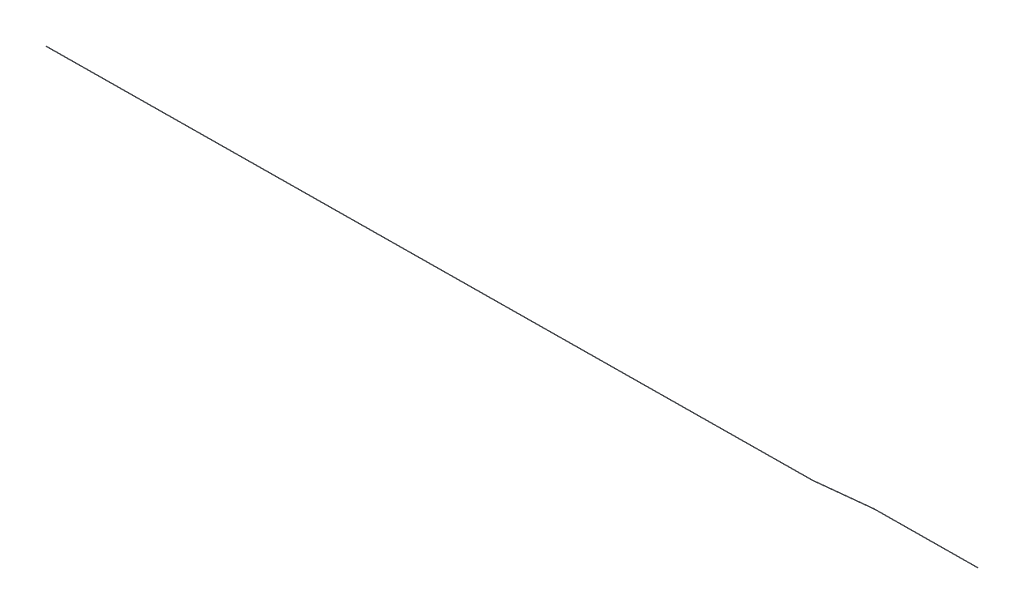
ISO-10303-21;
HEADER;
FILE_DESCRIPTION(('STEP AP214'),'2;1');
FILE_NAME('part.step','',(''),(''),'','','');
FILE_SCHEMA(('AUTOMOTIVE_DESIGN { 1 0 10303 214 1 1 1 1 }'));
ENDSEC;
DATA;
#1=APPLICATION_CONTEXT('core data for automotive mechanical design processes');
#2=APPLICATION_PROTOCOL_DEFINITION('international standard','automotive_design',2000,#1);
#3=PRODUCT_CONTEXT('',#1,'mechanical');
#4=PRODUCT('Part','Part','',(#3));
#5=PRODUCT_RELATED_PRODUCT_CATEGORY('part','',(#4));
#6=PRODUCT_DEFINITION_FORMATION('','',#4);
#7=PRODUCT_DEFINITION_CONTEXT('part definition',#1,'design');
#8=PRODUCT_DEFINITION('design','',#6,#7);
#9=PRODUCT_DEFINITION_SHAPE('','',#8);
#10=(LENGTH_UNIT() NAMED_UNIT(*) SI_UNIT(.MILLI.,.METRE.));
#11=(NAMED_UNIT(*) PLANE_ANGLE_UNIT() SI_UNIT($,.RADIAN.));
#12=(NAMED_UNIT(*) SI_UNIT($,.STERADIAN.) SOLID_ANGLE_UNIT());
#13=UNCERTAINTY_MEASURE_WITH_UNIT(LENGTH_MEASURE(1.E-05),#10,'distance_accuracy_value','');
#14=(GEOMETRIC_REPRESENTATION_CONTEXT(3) GLOBAL_UNCERTAINTY_ASSIGNED_CONTEXT((#13)) GLOBAL_UNIT_ASSIGNED_CONTEXT((#10,
#11,#12)) REPRESENTATION_CONTEXT('',''));
#15=CARTESIAN_POINT('',(0.,0.,0.));
#16=DIRECTION('',(0.,0.,1.));
#17=DIRECTION('',(1.,0.,0.));
#18=AXIS2_PLACEMENT_3D('',#15,#16,#17);
#19=CARTESIAN_POINT('',(413.924770547285,-1.58560776822858,-7.11603817891515));
#20=DIRECTION('',(-0.999980147228154,-0.00533980812218147,0.00334538469796255));
#21=DIRECTION('',(0.00533983800292731,-0.99998574296342,0.));
#22=AXIS2_PLACEMENT_3D('',#19,#20,#21);
#23=PLANE('',#22);
#24=CARTESIAN_POINT('',(413.924770547285,-1.58560776822858,-7.11603817891515));
#25=DIRECTION('',(-0.999980147228154,-0.00533980812218147,0.00334538469796255));
#26=DIRECTION('',(0.00533983800292731,-0.99998574296342,0.));
#27=AXIS2_PLACEMENT_3D('',#24,#25,#26);
#28=CIRCLE('',#27,0.15);
#29=CARTESIAN_POINT('',(413.925571522985,-1.73560562967309,-7.11603817891515));
#30=VERTEX_POINT('',#29);
#31=EDGE_CURVE('E40',#30,#30,#28,.T.);
#32=ORIENTED_EDGE('',*,*,#31,.F.);
#33=EDGE_LOOP('',(#32));
#34=FACE_BOUND('',#33,.T.);
#35=ADVANCED_FACE('F37',(#34),#23,.F.);
#36=CARTESIAN_POINT('',(-387.158080084603,-7.56501526759895,-0.791581331178724));
#37=DIRECTION('',(-0.999962548308179,-0.00860432697053628,0.000931417412730323));
#38=DIRECTION('',(0.00860416806883576,-0.999962968239497,-0.000174474916960672));
#39=AXIS2_PLACEMENT_3D('',#36,#37,#38);
#40=PLANE('',#39);
#41=CARTESIAN_POINT('',(-387.158080084603,-7.56501526759895,-0.791581331178724));
#42=DIRECTION('',(-0.999962548308179,-0.00860432697053628,0.000931417412730323));
#43=DIRECTION('',(0.00860416806883576,-0.999962968239497,-0.000174474916960672));
#44=AXIS2_PLACEMENT_3D('',#41,#42,#43);
#45=CIRCLE('',#44,0.15);
#46=CARTESIAN_POINT('',(-387.156789459393,-7.71500971283488,-0.791607502416268));
#47=VERTEX_POINT('',#46);
#48=EDGE_CURVE('E44',#47,#47,#45,.T.);
#49=ORIENTED_EDGE('',*,*,#48,.T.);
#50=EDGE_LOOP('',(#49));
#51=FACE_BOUND('',#50,.T.);
#52=ADVANCED_FACE('F60',(#51),#40,.T.);
#53=CARTESIAN_POINT('',(324.053927769802,-2.06551035183558,-6.81537966778954));
#54=DIRECTION('',(0.999980147228154,0.00533980812218148,-0.00334538469796255));
#55=DIRECTION('',(-0.00533983800292731,0.99998574296342,0.));
#56=AXIS2_PLACEMENT_3D('',#53,#54,#55);
#57=CYLINDRICAL_SURFACE('',#56,0.15);
#58=CARTESIAN_POINT('',(324.253923799248,-2.06444239021114,-6.81604874472912));
#59=DIRECTION('',(0.998307133454409,0.000468158546201777,-0.0581605374942275));
#60=DIRECTION('',(-0.0578907967974328,-0.0885307727506247,-0.994389741460729));
#61=AXIS2_PLACEMENT_3D('',#58,#59,#60);
#62=ELLIPSE('',#61,0.150227687556065,0.15);
#63=CARTESIAN_POINT('',(324.245226998714,-2.07774216347902,-6.96543361611824));
#64=VERTEX_POINT('',#63);
#65=EDGE_CURVE('E49',#64,#64,#62,.T.);
#66=ORIENTED_EDGE('',*,*,#65,.T.);
#67=EDGE_LOOP('',(#66));
#68=FACE_BOUND('',#67,.T.);
#69=ORIENTED_EDGE('',*,*,#31,.T.);
#70=EDGE_LOOP('',(#69));
#71=FACE_BOUND('',#70,.T.);
#72=ADVANCED_FACE('F57',(#68,#71),#57,.T.);
#73=CARTESIAN_POINT('',(276.434186868763,-1.85244566753153,-1.3873110938964));
#74=DIRECTION('',(0.99360801823271,-0.0044049101273753,-0.112799392154551));
#75=DIRECTION('',(-0.112800486506934,0.,-0.993617657977051));
#76=AXIS2_PLACEMENT_3D('',#73,#74,#75);
#77=CYLINDRICAL_SURFACE('',#76,0.15);
#78=CARTESIAN_POINT('',(276.632908472409,-1.85332664955701,-1.4098709723273));
#79=DIRECTION('',(0.998374470676734,0.00210305601332011,-0.0569560660189663));
#80=DIRECTION('',(0.0563339904475366,0.115329100610072,0.991728632274338));
#81=AXIS2_PLACEMENT_3D('',#78,#79,#80);
#82=ELLIPSE('',#81,0.150239146900485,0.15);
#83=CARTESIAN_POINT('',(276.641372043076,-1.83599970386855,-1.26087450865761));
#84=VERTEX_POINT('',#83);
#85=EDGE_CURVE('E11',#84,#84,#82,.T.);
#86=ORIENTED_EDGE('',*,*,#85,.T.);
#87=EDGE_LOOP('',(#86));
#88=FACE_BOUND('',#87,.T.);
#89=ORIENTED_EDGE('',*,*,#65,.F.);
#90=EDGE_LOOP('',(#89));
#91=FACE_BOUND('',#90,.T.);
#92=ADVANCED_FACE('F67',(#88,#91),#77,.T.);
#93=CARTESIAN_POINT('',(-387.158080084603,-7.56501526759895,-0.791581331178724));
#94=DIRECTION('',(0.999962548308179,0.00860432697053628,-0.000931417412730323));
#95=DIRECTION('',(-0.00860433070283072,0.999962982061414,0.));
#96=AXIS2_PLACEMENT_3D('',#93,#94,#95);
#97=CYLINDRICAL_SURFACE('',#96,0.15);
#98=ORIENTED_EDGE('',*,*,#48,.F.);
#99=EDGE_LOOP('',(#98));
#100=FACE_BOUND('',#99,.T.);
#101=ORIENTED_EDGE('',*,*,#85,.F.);
#102=EDGE_LOOP('',(#101));
#103=FACE_BOUND('',#102,.T.);
#104=ADVANCED_FACE('F65',(#100,#103),#97,.T.);
#105=CLOSED_SHELL('',(#35,#52,#72,#92,#104));
#106=MANIFOLD_SOLID_BREP('B2',#105);
#107=ADVANCED_BREP_SHAPE_REPRESENTATION('',(#18,#106),#14);
#108=SHAPE_DEFINITION_REPRESENTATION(#9,#107);
ENDSEC;
END-ISO-10303-21;
